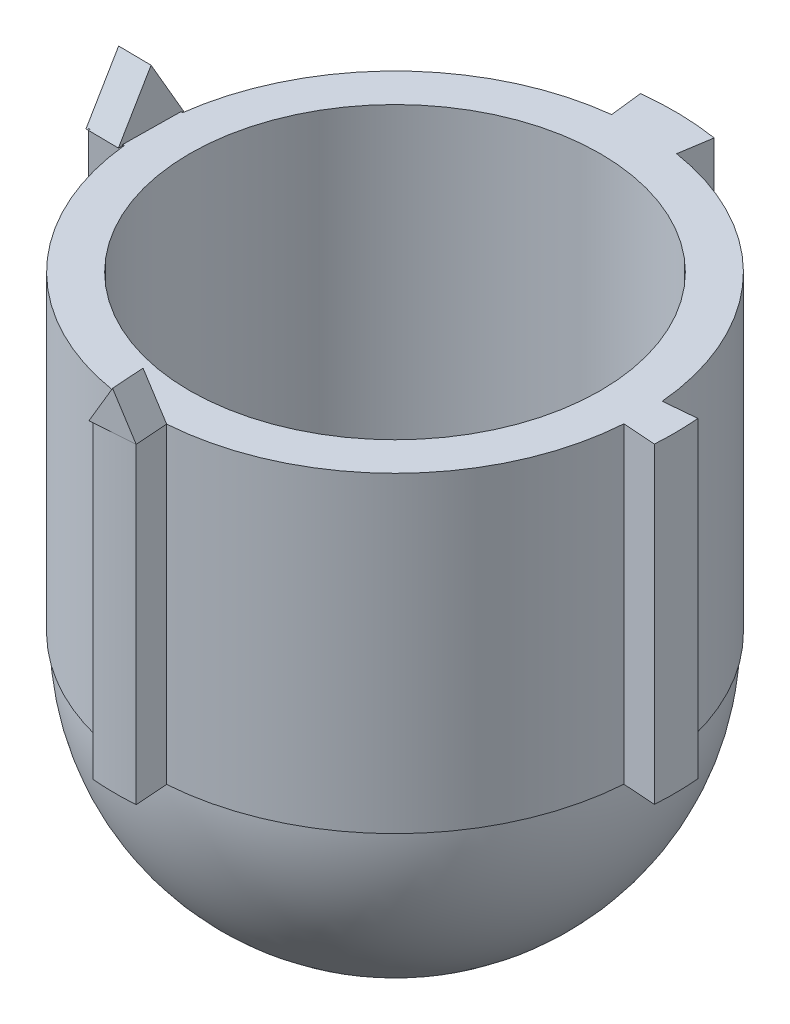
ISO-10303-21;
HEADER;
FILE_DESCRIPTION(('STEP AP214'),'2;1');
FILE_NAME('part.step','',(''),(''),'','','');
FILE_SCHEMA(('AUTOMOTIVE_DESIGN { 1 0 10303 214 1 1 1 1 }'));
ENDSEC;
DATA;
#1=APPLICATION_CONTEXT('core data for automotive mechanical design processes');
#2=APPLICATION_PROTOCOL_DEFINITION('international standard','automotive_design',2000,#1);
#3=PRODUCT_CONTEXT('',#1,'mechanical');
#4=PRODUCT('Part','Part','',(#3));
#5=PRODUCT_RELATED_PRODUCT_CATEGORY('part','',(#4));
#6=PRODUCT_DEFINITION_FORMATION('','',#4);
#7=PRODUCT_DEFINITION_CONTEXT('part definition',#1,'design');
#8=PRODUCT_DEFINITION('design','',#6,#7);
#9=PRODUCT_DEFINITION_SHAPE('','',#8);
#10=(LENGTH_UNIT() NAMED_UNIT(*) SI_UNIT(.MILLI.,.METRE.));
#11=(NAMED_UNIT(*) PLANE_ANGLE_UNIT() SI_UNIT($,.RADIAN.));
#12=(NAMED_UNIT(*) SI_UNIT($,.STERADIAN.) SOLID_ANGLE_UNIT());
#13=UNCERTAINTY_MEASURE_WITH_UNIT(LENGTH_MEASURE(1.E-05),#10,'distance_accuracy_value','');
#14=(GEOMETRIC_REPRESENTATION_CONTEXT(3) GLOBAL_UNCERTAINTY_ASSIGNED_CONTEXT((#13)) GLOBAL_UNIT_ASSIGNED_CONTEXT((#10,
#11,#12)) REPRESENTATION_CONTEXT('',''));
#15=CARTESIAN_POINT('',(0.,0.,0.));
#16=DIRECTION('',(0.,0.,1.));
#17=DIRECTION('',(1.,0.,0.));
#18=AXIS2_PLACEMENT_3D('',#15,#16,#17);
#19=CARTESIAN_POINT('',(0.,19.,0.));
#20=DIRECTION('',(0.,1.,0.));
#21=DIRECTION('',(0.,0.,1.));
#22=AXIS2_PLACEMENT_3D('',#19,#20,#21);
#23=PLANE('',#22);
#24=DIRECTION('',(-0.99991980307442,0.,-0.012664415486466));
#25=VECTOR('',#24,1.);
#26=CARTESIAN_POINT('',(0.0238732234541416,19.,-1.88491201354909));
#27=LINE('',#26,#25);
#28=CARTESIAN_POINT('',(-16.0518718364044,19.,-2.08851825683638));
#29=VERTEX_POINT('',#28);
#30=CARTESIAN_POINT('',(-16.8699349540087,19.,-2.09887937898202));
#31=VERTEX_POINT('',#30);
#32=EDGE_CURVE('E282',#29,#31,#27,.T.);
#33=ORIENTED_EDGE('',*,*,#32,.F.);
#34=DIRECTION('',(-0.99164159391928,0.,-0.12902305688996));
#35=VECTOR('',#34,1.);
#36=CARTESIAN_POINT('',(-16.8579070966278,19.,-2.19339196712932));
#37=LINE('',#36,#35);
#38=CARTESIAN_POINT('',(-16.8579070966278,19.,-2.19339196712932));
#39=VERTEX_POINT('',#38);
#40=EDGE_CURVE('E338',#29,#39,#37,.T.);
#41=ORIENTED_EDGE('',*,*,#40,.T.);
#42=CARTESIAN_POINT('',(0.,19.,0.));
#43=DIRECTION('',(0.,1.,0.));
#44=DIRECTION('',(0.,0.,-1.));
#45=AXIS2_PLACEMENT_3D('',#42,#43,#44);
#46=CIRCLE('',#45,17.);
#47=EDGE_CURVE('E344',#39,#31,#46,.T.);
#48=ORIENTED_EDGE('',*,*,#47,.T.);
#49=EDGE_LOOP('',(#33,#41,#48));
#50=FACE_BOUND('',#49,.T.);
#51=ADVANCED_FACE('F35',(#50),#23,.T.);
#52=CARTESIAN_POINT('',(0.,19.,0.));
#53=DIRECTION('',(0.,1.,0.));
#54=DIRECTION('',(0.,0.,1.));
#55=AXIS2_PLACEMENT_3D('',#52,#53,#54);
#56=CIRCLE('',#55,12.5);
#57=CARTESIAN_POINT('',(0.,19.,12.5));
#58=VERTEX_POINT('',#57);
#59=EDGE_CURVE('E329',#58,#58,#56,.T.);
#60=ORIENTED_EDGE('',*,*,#59,.F.);
#61=EDGE_LOOP('',(#60));
#62=FACE_BOUND('',#61,.T.);
#63=CARTESIAN_POINT('',(-14.8746239087892,19.,-1.9353458533494));
#64=VERTEX_POINT('',#63);
#65=CARTESIAN_POINT('',(-14.9765231401734,19.,-1.94860402082498));
#66=VERTEX_POINT('',#65);
#67=EDGE_CURVE('E340',#64,#66,#37,.T.);
#68=ORIENTED_EDGE('',*,*,#67,.T.);
#69=DIRECTION('',(-0.0126644154864656,0.,0.99991980307442));
#70=VECTOR('',#69,1.);
#71=CARTESIAN_POINT('',(-14.9987970461163,19.,-0.189966232296984));
#72=LINE('',#71,#70);
#73=CARTESIAN_POINT('',(-15.0210709520592,19.,1.568671556231));
#74=VERTEX_POINT('',#73);
#75=EDGE_CURVE('E267',#66,#74,#72,.T.);
#76=ORIENTED_EDGE('',*,*,#75,.T.);
#77=DIRECTION('',(0.994591241362186,0.,-0.103866561537509));
#78=VECTOR('',#77,1.);
#79=CARTESIAN_POINT('',(-16.9080511031572,19.,1.76573154613765));
#80=LINE('',#79,#78);
#81=CARTESIAN_POINT('',(-14.9188686204328,19.,1.55799842306263));
#82=VERTEX_POINT('',#81);
#83=EDGE_CURVE('E347',#74,#82,#80,.T.);
#84=ORIENTED_EDGE('',*,*,#83,.T.);
#85=CARTESIAN_POINT('',(0.,19.,0.));
#86=DIRECTION('',(0.,1.,0.));
#87=DIRECTION('',(0.,0.,1.));
#88=AXIS2_PLACEMENT_3D('',#85,#86,#87);
#89=CIRCLE('',#88,15.);
#90=CARTESIAN_POINT('',(-1.2901495141034,19.,14.9444141481444));
#91=VERTEX_POINT('',#90);
#92=EDGE_CURVE('E351',#82,#91,#89,.T.);
#93=ORIENTED_EDGE('',*,*,#92,.T.);
#94=DIRECTION('',(-0.0860099676068932,0.,0.996294276542961));
#95=VECTOR('',#94,1.);
#96=CARTESIAN_POINT('',(-1.46216944931718,19.,16.9370027012303));
#97=LINE('',#96,#95);
#98=CARTESIAN_POINT('',(-1.30617713125256,19.,15.1300696445552));
#99=VERTEX_POINT('',#98);
#100=EDGE_CURVE('E354',#91,#99,#97,.T.);
#101=ORIENTED_EDGE('',*,*,#100,.T.);
#102=DIRECTION('',(0.997501741299744,0.,-0.0706418863279979));
#103=VECTOR('',#102,1.);
#104=CARTESIAN_POINT('',(1.05962829491996,19.,14.9625261194962));
#105=LINE('',#104,#103);
#106=CARTESIAN_POINT('',(1.05962829491996,19.,14.9625261194962));
#107=VERTEX_POINT('',#106);
#108=EDGE_CURVE('E292',#99,#107,#105,.T.);
#109=ORIENTED_EDGE('',*,*,#108,.T.);
#110=CARTESIAN_POINT('',(0.,19.,0.));
#111=DIRECTION('',(0.,1.,0.));
#112=DIRECTION('',(0.,0.,1.));
#113=AXIS2_PLACEMENT_3D('',#110,#111,#112);
#114=CIRCLE('',#113,15.);
#115=CARTESIAN_POINT('',(14.9646165419444,19.,1.02968526869291));
#116=VERTEX_POINT('',#115);
#117=EDGE_CURVE('E362',#107,#116,#114,.T.);
#118=ORIENTED_EDGE('',*,*,#117,.T.);
#119=DIRECTION('',(0.997641102796295,0.,0.0686456845795273));
#120=VECTOR('',#119,1.);
#121=CARTESIAN_POINT('',(16.959898747537,19.,1.16697663785196));
#122=LINE('',#121,#120);
#123=CARTESIAN_POINT('',(16.959898747537,19.,1.16697663785196));
#124=VERTEX_POINT('',#123);
#125=EDGE_CURVE('E364',#116,#124,#122,.T.);
#126=ORIENTED_EDGE('',*,*,#125,.T.);
#127=CARTESIAN_POINT('',(0.,19.,0.));
#128=DIRECTION('',(0.,1.,0.));
#129=DIRECTION('',(0.,0.,-1.));
#130=AXIS2_PLACEMENT_3D('',#127,#128,#129);
#131=CIRCLE('',#130,17.);
#132=CARTESIAN_POINT('',(16.9329824125417,19.,-1.50801413009047));
#133=VERTEX_POINT('',#132);
#134=EDGE_CURVE('E366',#124,#133,#131,.T.);
#135=ORIENTED_EDGE('',*,*,#134,.T.);
#136=DIRECTION('',(-0.996057788973043,0.,0.0887067135347335));
#137=VECTOR('',#136,1.);
#138=CARTESIAN_POINT('',(16.9329824125417,19.,-1.50801413009047));
#139=LINE('',#138,#137);
#140=CARTESIAN_POINT('',(14.9408668345956,19.,-1.330600703021));
#141=VERTEX_POINT('',#140);
#142=EDGE_CURVE('E368',#133,#141,#139,.T.);
#143=ORIENTED_EDGE('',*,*,#142,.T.);
#144=CARTESIAN_POINT('',(0.,19.,0.));
#145=DIRECTION('',(0.,1.,0.));
#146=DIRECTION('',(0.,0.,1.));
#147=AXIS2_PLACEMENT_3D('',#144,#145,#146);
#148=CIRCLE('',#147,15.);
#149=CARTESIAN_POINT('',(2.32803345196332,19.,-14.818240794593));
#150=VERTEX_POINT('',#149);
#151=EDGE_CURVE('E370',#141,#150,#148,.T.);
#152=ORIENTED_EDGE('',*,*,#151,.T.);
#153=DIRECTION('',(0.155202230130888,0.,-0.987882719639532));
#154=VECTOR('',#153,1.);
#155=CARTESIAN_POINT('',(2.63843791222509,19.,-16.7940062338721));
#156=LINE('',#155,#154);
#157=CARTESIAN_POINT('',(2.63843791222509,19.,-16.7940062338721));
#158=VERTEX_POINT('',#157);
#159=EDGE_CURVE('E372',#150,#158,#156,.T.);
#160=ORIENTED_EDGE('',*,*,#159,.T.);
#161=CARTESIAN_POINT('',(0.,19.,0.));
#162=DIRECTION('',(0.,1.,0.));
#163=DIRECTION('',(0.,0.,1.));
#164=AXIS2_PLACEMENT_3D('',#161,#162,#163);
#165=CIRCLE('',#164,17.);
#166=CARTESIAN_POINT('',(-1.94175157276121,19.,-16.8887418367882));
#167=VERTEX_POINT('',#166);
#168=EDGE_CURVE('E374',#158,#167,#165,.T.);
#169=ORIENTED_EDGE('',*,*,#168,.T.);
#170=DIRECTION('',(0.11422068075066,0.,0.993455402164011));
#171=VECTOR('',#170,1.);
#172=CARTESIAN_POINT('',(-1.94175157276122,19.,-16.8887418367882));
#173=LINE('',#172,#171);
#174=CARTESIAN_POINT('',(-1.7133102112599,19.,-14.9018310324602));
#175=VERTEX_POINT('',#174);
#176=EDGE_CURVE('E376',#167,#175,#173,.T.);
#177=ORIENTED_EDGE('',*,*,#176,.T.);
#178=CARTESIAN_POINT('',(0.,19.,0.));
#179=DIRECTION('',(0.,1.,0.));
#180=DIRECTION('',(0.,0.,1.));
#181=AXIS2_PLACEMENT_3D('',#178,#179,#180);
#182=CIRCLE('',#181,15.);
#183=EDGE_CURVE('E335',#175,#64,#182,.T.);
#184=ORIENTED_EDGE('',*,*,#183,.T.);
#185=EDGE_LOOP('',(#68,#76,#84,#93,#101,#109,#118,#126,#135,#143,#152,#160,#169,#177,#184));
#186=FACE_BOUND('',#185,.T.);
#187=ADVANCED_FACE('F496',(#62,#186),#23,.T.);
#188=CARTESIAN_POINT('',(0.,0.,0.));
#189=DIRECTION('',(0.,1.,0.));
#190=DIRECTION('',(0.,0.,1.));
#191=AXIS2_PLACEMENT_3D('',#188,#189,#190);
#192=PLANE('',#191);
#193=CARTESIAN_POINT('',(0.,0.,0.));
#194=DIRECTION('',(0.,-1.,0.));
#195=DIRECTION('',(1.,0.,0.));
#196=AXIS2_PLACEMENT_3D('',#193,#194,#195);
#197=CIRCLE('',#196,14.8746239087892);
#198=CARTESIAN_POINT('',(14.8746239087892,0.,0.));
#199=VERTEX_POINT('',#198);
#200=EDGE_CURVE('E325',#199,#199,#197,.T.);
#201=ORIENTED_EDGE('',*,*,#200,.F.);
#202=EDGE_LOOP('',(#201));
#203=FACE_BOUND('',#202,.T.);
#204=CARTESIAN_POINT('',(0.,0.,0.));
#205=DIRECTION('',(0.,1.,0.));
#206=DIRECTION('',(0.,0.,1.));
#207=AXIS2_PLACEMENT_3D('',#204,#205,#206);
#208=CIRCLE('',#207,15.);
#209=CARTESIAN_POINT('',(-1.7133102112599,0.,-14.9018310324602));
#210=VERTEX_POINT('',#209);
#211=CARTESIAN_POINT('',(-14.8746239087892,0.,-1.9353458533494));
#212=VERTEX_POINT('',#211);
#213=EDGE_CURVE('E332',#210,#212,#208,.T.);
#214=ORIENTED_EDGE('',*,*,#213,.F.);
#215=DIRECTION('',(0.11422068075066,0.,0.993455402164011));
#216=VECTOR('',#215,1.);
#217=CARTESIAN_POINT('',(-1.94175157276122,0.,-16.8887418367882));
#218=LINE('',#217,#216);
#219=CARTESIAN_POINT('',(-1.94175157276121,0.,-16.8887418367882));
#220=VERTEX_POINT('',#219);
#221=EDGE_CURVE('E339',#220,#210,#218,.T.);
#222=ORIENTED_EDGE('',*,*,#221,.F.);
#223=CARTESIAN_POINT('',(0.,0.,0.));
#224=DIRECTION('',(0.,1.,0.));
#225=DIRECTION('',(0.,0.,1.));
#226=AXIS2_PLACEMENT_3D('',#223,#224,#225);
#227=CIRCLE('',#226,17.);
#228=CARTESIAN_POINT('',(2.63843791222509,0.,-16.7940062338721));
#229=VERTEX_POINT('',#228);
#230=EDGE_CURVE('E408',#229,#220,#227,.T.);
#231=ORIENTED_EDGE('',*,*,#230,.F.);
#232=DIRECTION('',(0.155202230130888,0.,-0.987882719639532));
#233=VECTOR('',#232,1.);
#234=CARTESIAN_POINT('',(2.63843791222509,0.,-16.7940062338721));
#235=LINE('',#234,#233);
#236=CARTESIAN_POINT('',(2.32803345196332,0.,-14.818240794593));
#237=VERTEX_POINT('',#236);
#238=EDGE_CURVE('E406',#237,#229,#235,.T.);
#239=ORIENTED_EDGE('',*,*,#238,.F.);
#240=CARTESIAN_POINT('',(0.,0.,0.));
#241=DIRECTION('',(0.,1.,0.));
#242=DIRECTION('',(0.,0.,1.));
#243=AXIS2_PLACEMENT_3D('',#240,#241,#242);
#244=CIRCLE('',#243,15.);
#245=CARTESIAN_POINT('',(14.9408668345956,0.,-1.330600703021));
#246=VERTEX_POINT('',#245);
#247=EDGE_CURVE('E404',#246,#237,#244,.T.);
#248=ORIENTED_EDGE('',*,*,#247,.F.);
#249=DIRECTION('',(-0.996057788973043,0.,0.0887067135347335));
#250=VECTOR('',#249,1.);
#251=CARTESIAN_POINT('',(16.9329824125417,0.,-1.50801413009047));
#252=LINE('',#251,#250);
#253=CARTESIAN_POINT('',(16.9329824125417,0.,-1.50801413009047));
#254=VERTEX_POINT('',#253);
#255=EDGE_CURVE('E402',#254,#246,#252,.T.);
#256=ORIENTED_EDGE('',*,*,#255,.F.);
#257=CARTESIAN_POINT('',(0.,0.,0.));
#258=DIRECTION('',(0.,1.,0.));
#259=DIRECTION('',(0.,0.,-1.));
#260=AXIS2_PLACEMENT_3D('',#257,#258,#259);
#261=CIRCLE('',#260,17.);
#262=CARTESIAN_POINT('',(16.959898747537,0.,1.16697663785196));
#263=VERTEX_POINT('',#262);
#264=EDGE_CURVE('E400',#263,#254,#261,.T.);
#265=ORIENTED_EDGE('',*,*,#264,.F.);
#266=DIRECTION('',(0.997641102796295,0.,0.0686456845795273));
#267=VECTOR('',#266,1.);
#268=CARTESIAN_POINT('',(16.959898747537,0.,1.16697663785196));
#269=LINE('',#268,#267);
#270=CARTESIAN_POINT('',(14.9646165419444,0.,1.02968526869291));
#271=VERTEX_POINT('',#270);
#272=EDGE_CURVE('E398',#271,#263,#269,.T.);
#273=ORIENTED_EDGE('',*,*,#272,.F.);
#274=CARTESIAN_POINT('',(0.,0.,0.));
#275=DIRECTION('',(0.,1.,0.));
#276=DIRECTION('',(0.,0.,1.));
#277=AXIS2_PLACEMENT_3D('',#274,#275,#276);
#278=CIRCLE('',#277,15.);
#279=CARTESIAN_POINT('',(1.05962829491996,0.,14.9625261194962));
#280=VERTEX_POINT('',#279);
#281=EDGE_CURVE('E396',#280,#271,#278,.T.);
#282=ORIENTED_EDGE('',*,*,#281,.F.);
#283=DIRECTION('',(-0.0706418863279975,0.,-0.997501741299744));
#284=VECTOR('',#283,1.);
#285=CARTESIAN_POINT('',(1.20091206757596,0.,16.9575296020957));
#286=LINE('',#285,#284);
#287=CARTESIAN_POINT('',(1.20091206757596,0.,16.9575296020957));
#288=VERTEX_POINT('',#287);
#289=EDGE_CURVE('E394',#288,#280,#286,.T.);
#290=ORIENTED_EDGE('',*,*,#289,.F.);
#291=CARTESIAN_POINT('',(0.,0.,0.));
#292=DIRECTION('',(0.,1.,0.));
#293=DIRECTION('',(0.,0.,-1.));
#294=AXIS2_PLACEMENT_3D('',#291,#292,#293);
#295=CIRCLE('',#294,17.);
#296=CARTESIAN_POINT('',(-1.46216944931718,0.,16.9370027012303));
#297=VERTEX_POINT('',#296);
#298=EDGE_CURVE('E392',#297,#288,#295,.T.);
#299=ORIENTED_EDGE('',*,*,#298,.F.);
#300=DIRECTION('',(-0.0860099676068932,0.,0.996294276542961));
#301=VECTOR('',#300,1.);
#302=CARTESIAN_POINT('',(-1.46216944931718,0.,16.9370027012303));
#303=LINE('',#302,#301);
#304=CARTESIAN_POINT('',(-1.2901495141034,0.,14.9444141481444));
#305=VERTEX_POINT('',#304);
#306=EDGE_CURVE('E390',#305,#297,#303,.T.);
#307=ORIENTED_EDGE('',*,*,#306,.F.);
#308=CARTESIAN_POINT('',(0.,0.,0.));
#309=DIRECTION('',(0.,1.,0.));
#310=DIRECTION('',(0.,0.,1.));
#311=AXIS2_PLACEMENT_3D('',#308,#309,#310);
#312=CIRCLE('',#311,15.);
#313=CARTESIAN_POINT('',(-14.9188686204328,0.,1.55799842306263));
#314=VERTEX_POINT('',#313);
#315=EDGE_CURVE('E388',#314,#305,#312,.T.);
#316=ORIENTED_EDGE('',*,*,#315,.F.);
#317=DIRECTION('',(0.994591241362186,0.,-0.103866561537509));
#318=VECTOR('',#317,1.);
#319=CARTESIAN_POINT('',(-16.9080511031572,0.,1.76573154613765));
#320=LINE('',#319,#318);
#321=CARTESIAN_POINT('',(-16.9080511031572,0.,1.76573154613765));
#322=VERTEX_POINT('',#321);
#323=EDGE_CURVE('E386',#322,#314,#320,.T.);
#324=ORIENTED_EDGE('',*,*,#323,.F.);
#325=CARTESIAN_POINT('',(0.,0.,0.));
#326=DIRECTION('',(0.,1.,0.));
#327=DIRECTION('',(0.,0.,-1.));
#328=AXIS2_PLACEMENT_3D('',#325,#326,#327);
#329=CIRCLE('',#328,17.);
#330=CARTESIAN_POINT('',(-16.8579070966278,0.,-2.19339196712932));
#331=VERTEX_POINT('',#330);
#332=EDGE_CURVE('E383',#331,#322,#329,.T.);
#333=ORIENTED_EDGE('',*,*,#332,.F.);
#334=DIRECTION('',(-0.99164159391928,0.,-0.12902305688996));
#335=VECTOR('',#334,1.);
#336=CARTESIAN_POINT('',(-16.8579070966278,0.,-2.19339196712932));
#337=LINE('',#336,#335);
#338=EDGE_CURVE('E381',#212,#331,#337,.T.);
#339=ORIENTED_EDGE('',*,*,#338,.F.);
#340=EDGE_LOOP('',(#214,#222,#231,#239,#248,#256,#265,#273,#282,#290,#299,#307,#316,#324,#333,#339));
#341=FACE_BOUND('',#340,.T.);
#342=ADVANCED_FACE('F506',(#203,#341),#192,.F.);
#343=CARTESIAN_POINT('',(0.,19.,0.));
#344=DIRECTION('',(0.,-1.,0.));
#345=DIRECTION('',(0.,0.,-1.));
#346=AXIS2_PLACEMENT_3D('',#343,#344,#345);
#347=CYLINDRICAL_SURFACE('',#346,15.);
#348=ORIENTED_EDGE('',*,*,#213,.T.);
#349=DIRECTION('',(0.,-1.,0.));
#350=VECTOR('',#349,1.);
#351=CARTESIAN_POINT('',(-14.8746239087892,19.,-1.9353458533494));
#352=LINE('',#351,#350);
#353=EDGE_CURVE('E456',#64,#212,#352,.T.);
#354=ORIENTED_EDGE('',*,*,#353,.F.);
#355=ORIENTED_EDGE('',*,*,#183,.F.);
#356=DIRECTION('',(0.,-1.,0.));
#357=VECTOR('',#356,1.);
#358=CARTESIAN_POINT('',(-1.7133102112599,19.,-14.9018310324602));
#359=LINE('',#358,#357);
#360=EDGE_CURVE('E378',#175,#210,#359,.T.);
#361=ORIENTED_EDGE('',*,*,#360,.T.);
#362=EDGE_LOOP('',(#348,#354,#355,#361));
#363=FACE_BOUND('',#362,.T.);
#364=ADVANCED_FACE('F37',(#363),#347,.T.);
#365=CARTESIAN_POINT('',(-16.8579070966278,19.,-2.19339196712932));
#366=DIRECTION('',(-0.12902305688996,0.,0.99164159391928));
#367=DIRECTION('',(0.99164159391928,0.,0.12902305688996));
#368=AXIS2_PLACEMENT_3D('',#365,#366,#367);
#369=PLANE('',#368);
#370=ORIENTED_EDGE('',*,*,#40,.F.);
#371=DIRECTION('',(-0.972064647153889,-0.197722460097862,-0.126475889111065));
#372=VECTOR('',#371,1.);
#373=CARTESIAN_POINT('',(-16.8263958161495,18.8424582283407,-2.1892920163419));
#374=LINE('',#373,#372);
#375=CARTESIAN_POINT('',(-16.361393564257,18.9370418442189,-2.12879030648244));
#376=VERTEX_POINT('',#375);
#377=EDGE_CURVE('E50',#29,#376,#374,.T.);
#378=ORIENTED_EDGE('',*,*,#377,.T.);
#379=DIRECTION('',(0.99164159391928,0.,0.12902305688996));
#380=VECTOR('',#379,1.);
#381=CARTESIAN_POINT('',(-16.8579070966278,18.9370418442189,-2.19339196712932));
#382=LINE('',#381,#380);
#383=CARTESIAN_POINT('',(-14.9765231401734,18.9370418442189,-1.94860402082498));
#384=VERTEX_POINT('',#383);
#385=EDGE_CURVE('E54',#376,#384,#382,.T.);
#386=ORIENTED_EDGE('',*,*,#385,.T.);
#387=DIRECTION('',(0.,-1.,0.));
#388=VECTOR('',#387,1.);
#389=CARTESIAN_POINT('',(-14.9765231401734,19.,-1.94860402082498));
#390=LINE('',#389,#388);
#391=EDGE_CURVE('E246',#66,#384,#390,.T.);
#392=ORIENTED_EDGE('',*,*,#391,.F.);
#393=ORIENTED_EDGE('',*,*,#67,.F.);
#394=ORIENTED_EDGE('',*,*,#353,.T.);
#395=ORIENTED_EDGE('',*,*,#338,.T.);
#396=DIRECTION('',(0.,-1.,0.));
#397=VECTOR('',#396,1.);
#398=CARTESIAN_POINT('',(-16.8579070966278,19.,-2.19339196712932));
#399=LINE('',#398,#397);
#400=EDGE_CURVE('E453',#39,#331,#399,.T.);
#401=ORIENTED_EDGE('',*,*,#400,.F.);
#402=EDGE_LOOP('',(#370,#378,#386,#392,#393,#394,#395,#401));
#403=FACE_BOUND('',#402,.T.);
#404=ADVANCED_FACE('F499',(#403),#369,.F.);
#405=CARTESIAN_POINT('',(0.,19.,0.));
#406=DIRECTION('',(0.,-1.,0.));
#407=DIRECTION('',(0.,0.,-1.));
#408=AXIS2_PLACEMENT_3D('',#405,#406,#407);
#409=CYLINDRICAL_SURFACE('',#408,17.);
#410=DIRECTION('',(0.,-1.,0.));
#411=VECTOR('',#410,1.);
#412=CARTESIAN_POINT('',(-16.9080511031572,19.,1.76573154613765));
#413=LINE('',#412,#411);
#414=CARTESIAN_POINT('',(-16.9080511031572,18.9370418442189,1.76573154613765));
#415=VERTEX_POINT('',#414);
#416=EDGE_CURVE('E449',#415,#322,#413,.T.);
#417=ORIENTED_EDGE('',*,*,#416,.F.);
#418=CARTESIAN_POINT('',(0.,18.9370418442189,0.));
#419=DIRECTION('',(0.,-1.,0.));
#420=DIRECTION('',(0.,0.,-1.));
#421=AXIS2_PLACEMENT_3D('',#418,#419,#420);
#422=CIRCLE('',#421,17.);
#423=CARTESIAN_POINT('',(-16.9986366522651,18.9370418442189,-0.215295063269916));
#424=VERTEX_POINT('',#423);
#425=EDGE_CURVE('E273',#415,#424,#422,.T.);
#426=ORIENTED_EDGE('',*,*,#425,.T.);
#427=CARTESIAN_POINT('',(-16.8653797492716,18.9370418442189,-2.13517350884211));
#428=VERTEX_POINT('',#427);
#429=EDGE_CURVE('E275',#424,#428,#422,.T.);
#430=ORIENTED_EDGE('',*,*,#429,.T.);
#431=CARTESIAN_POINT('',(0.,22.2650252202486,0.));
#432=DIRECTION('',(0.0109677055353606,0.500000000000004,-0.865955951209578));
#433=DIRECTION('',(0.00633220774323305,-0.866025403784436,-0.499959901537214));
#434=AXIS2_PLACEMENT_3D('',#431,#432,#433);
#435=ELLIPSE('',#434,33.9999999999997,17.);
#436=EDGE_CURVE('E11',#428,#31,#435,.T.);
#437=ORIENTED_EDGE('',*,*,#436,.T.);
#438=ORIENTED_EDGE('',*,*,#47,.F.);
#439=ORIENTED_EDGE('',*,*,#400,.T.);
#440=ORIENTED_EDGE('',*,*,#332,.T.);
#441=EDGE_LOOP('',(#417,#426,#430,#437,#438,#439,#440));
#442=FACE_BOUND('',#441,.T.);
#443=ADVANCED_FACE('F512',(#442),#409,.T.);
#444=CARTESIAN_POINT('',(-16.9080511031572,19.,1.76573154613765));
#445=DIRECTION('',(-0.103866561537509,0.,-0.994591241362186));
#446=DIRECTION('',(-0.994591241362187,0.,0.103866561537509));
#447=AXIS2_PLACEMENT_3D('',#444,#445,#446);
#448=PLANE('',#447);
#449=DIRECTION('',(0.,1.,0.));
#450=VECTOR('',#449,1.);
#451=CARTESIAN_POINT('',(-15.0210709520592,19.,1.568671556231));
#452=LINE('',#451,#450);
#453=CARTESIAN_POINT('',(-15.0210709520592,18.9370418442189,1.568671556231));
#454=VERTEX_POINT('',#453);
#455=EDGE_CURVE('E459',#454,#74,#452,.T.);
#456=ORIENTED_EDGE('',*,*,#455,.F.);
#457=DIRECTION('',(-0.994591241362187,0.,0.103866561537509));
#458=VECTOR('',#457,1.);
#459=CARTESIAN_POINT('',(-16.9080511031572,18.9370418442189,1.76573154613765));
#460=LINE('',#459,#458);
#461=EDGE_CURVE('E462',#454,#415,#460,.T.);
#462=ORIENTED_EDGE('',*,*,#461,.T.);
#463=ORIENTED_EDGE('',*,*,#416,.T.);
#464=ORIENTED_EDGE('',*,*,#323,.T.);
#465=DIRECTION('',(0.,-1.,0.));
#466=VECTOR('',#465,1.);
#467=CARTESIAN_POINT('',(-14.9188686204328,19.,1.55799842306263));
#468=LINE('',#467,#466);
#469=EDGE_CURVE('E446',#82,#314,#468,.T.);
#470=ORIENTED_EDGE('',*,*,#469,.F.);
#471=ORIENTED_EDGE('',*,*,#83,.F.);
#472=EDGE_LOOP('',(#456,#462,#463,#464,#470,#471));
#473=FACE_BOUND('',#472,.T.);
#474=ADVANCED_FACE('F491',(#473),#448,.F.);
#475=CARTESIAN_POINT('',(0.,19.,0.));
#476=DIRECTION('',(0.,-1.,0.));
#477=DIRECTION('',(0.,0.,-1.));
#478=AXIS2_PLACEMENT_3D('',#475,#476,#477);
#479=CYLINDRICAL_SURFACE('',#478,15.);
#480=ORIENTED_EDGE('',*,*,#315,.T.);
#481=DIRECTION('',(0.,-1.,0.));
#482=VECTOR('',#481,1.);
#483=CARTESIAN_POINT('',(-1.2901495141034,19.,14.9444141481444));
#484=LINE('',#483,#482);
#485=EDGE_CURVE('E443',#91,#305,#484,.T.);
#486=ORIENTED_EDGE('',*,*,#485,.F.);
#487=ORIENTED_EDGE('',*,*,#92,.F.);
#488=ORIENTED_EDGE('',*,*,#469,.T.);
#489=EDGE_LOOP('',(#480,#486,#487,#488));
#490=FACE_BOUND('',#489,.T.);
#491=ADVANCED_FACE('F540',(#490),#479,.T.);
#492=CARTESIAN_POINT('',(-1.46216944931718,19.,16.9370027012303));
#493=DIRECTION('',(0.996294276542961,0.,0.0860099676068932));
#494=DIRECTION('',(0.0860099676068932,0.,-0.996294276542961));
#495=AXIS2_PLACEMENT_3D('',#492,#493,#494);
#496=PLANE('',#495);
#497=ORIENTED_EDGE('',*,*,#306,.T.);
#498=DIRECTION('',(0.,-1.,0.));
#499=VECTOR('',#498,1.);
#500=CARTESIAN_POINT('',(-1.46216944931718,19.,16.9370027012303));
#501=LINE('',#500,#499);
#502=CARTESIAN_POINT('',(-1.46216944931718,19.,16.9370027012303));
#503=VERTEX_POINT('',#502);
#504=EDGE_CURVE('E440',#503,#297,#501,.T.);
#505=ORIENTED_EDGE('',*,*,#504,.F.);
#506=EDGE_CURVE('E353',#99,#503,#97,.T.);
#507=ORIENTED_EDGE('',*,*,#506,.F.);
#508=ORIENTED_EDGE('',*,*,#100,.F.);
#509=ORIENTED_EDGE('',*,*,#485,.T.);
#510=EDGE_LOOP('',(#497,#505,#507,#508,#509));
#511=FACE_BOUND('',#510,.T.);
#512=ADVANCED_FACE('F594',(#511),#496,.F.);
#513=CARTESIAN_POINT('',(0.,19.,0.));
#514=DIRECTION('',(0.,-1.,0.));
#515=DIRECTION('',(0.,0.,-1.));
#516=AXIS2_PLACEMENT_3D('',#513,#514,#515);
#517=CYLINDRICAL_SURFACE('',#516,17.);
#518=ORIENTED_EDGE('',*,*,#298,.T.);
#519=DIRECTION('',(0.,-1.,0.));
#520=VECTOR('',#519,1.);
#521=CARTESIAN_POINT('',(1.20091206757596,19.,16.9575296020957));
#522=LINE('',#521,#520);
#523=CARTESIAN_POINT('',(1.20091206757596,19.,16.9575296020957));
#524=VERTEX_POINT('',#523);
#525=EDGE_CURVE('E437',#524,#288,#522,.T.);
#526=ORIENTED_EDGE('',*,*,#525,.F.);
#527=CARTESIAN_POINT('',(0.,19.,0.));
#528=DIRECTION('',(0.,1.,0.));
#529=DIRECTION('',(0.,0.,-1.));
#530=AXIS2_PLACEMENT_3D('',#527,#528,#529);
#531=CIRCLE('',#530,17.);
#532=EDGE_CURVE('E357',#503,#524,#531,.T.);
#533=ORIENTED_EDGE('',*,*,#532,.F.);
#534=ORIENTED_EDGE('',*,*,#504,.T.);
#535=EDGE_LOOP('',(#518,#526,#533,#534));
#536=FACE_BOUND('',#535,.T.);
#537=ADVANCED_FACE('F590',(#536),#517,.T.);
#538=CARTESIAN_POINT('',(1.20091206757596,19.,16.9575296020957));
#539=DIRECTION('',(-0.997501741299744,0.,0.0706418863279975));
#540=DIRECTION('',(0.0706418863279975,0.,0.997501741299744));
#541=AXIS2_PLACEMENT_3D('',#538,#539,#540);
#542=PLANE('',#541);
#543=ORIENTED_EDGE('',*,*,#289,.T.);
#544=DIRECTION('',(0.,-1.,0.));
#545=VECTOR('',#544,1.);
#546=CARTESIAN_POINT('',(1.05962829491996,19.,14.9625261194962));
#547=LINE('',#546,#545);
#548=EDGE_CURVE('E434',#107,#280,#547,.T.);
#549=ORIENTED_EDGE('',*,*,#548,.F.);
#550=DIRECTION('',(-0.0706418863279975,0.,-0.997501741299744));
#551=VECTOR('',#550,1.);
#552=CARTESIAN_POINT('',(1.20091206757596,19.,16.9575296020957));
#553=LINE('',#552,#551);
#554=EDGE_CURVE('E359',#524,#107,#553,.T.);
#555=ORIENTED_EDGE('',*,*,#554,.F.);
#556=ORIENTED_EDGE('',*,*,#525,.T.);
#557=EDGE_LOOP('',(#543,#549,#555,#556));
#558=FACE_BOUND('',#557,.T.);
#559=ADVANCED_FACE('F586',(#558),#542,.F.);
#560=CARTESIAN_POINT('',(0.,19.,0.));
#561=DIRECTION('',(0.,-1.,0.));
#562=DIRECTION('',(0.,0.,-1.));
#563=AXIS2_PLACEMENT_3D('',#560,#561,#562);
#564=CYLINDRICAL_SURFACE('',#563,15.);
#565=ORIENTED_EDGE('',*,*,#281,.T.);
#566=DIRECTION('',(0.,-1.,0.));
#567=VECTOR('',#566,1.);
#568=CARTESIAN_POINT('',(14.9646165419444,19.,1.02968526869291));
#569=LINE('',#568,#567);
#570=EDGE_CURVE('E431',#116,#271,#569,.T.);
#571=ORIENTED_EDGE('',*,*,#570,.F.);
#572=ORIENTED_EDGE('',*,*,#117,.F.);
#573=ORIENTED_EDGE('',*,*,#548,.T.);
#574=EDGE_LOOP('',(#565,#571,#572,#573));
#575=FACE_BOUND('',#574,.T.);
#576=ADVANCED_FACE('F582',(#575),#564,.T.);
#577=CARTESIAN_POINT('',(16.959898747537,19.,1.16697663785196));
#578=DIRECTION('',(0.0686456845795273,0.,-0.997641102796295));
#579=DIRECTION('',(-0.997641102796295,0.,-0.0686456845795273));
#580=AXIS2_PLACEMENT_3D('',#577,#578,#579);
#581=PLANE('',#580);
#582=ORIENTED_EDGE('',*,*,#272,.T.);
#583=DIRECTION('',(0.,-1.,0.));
#584=VECTOR('',#583,1.);
#585=CARTESIAN_POINT('',(16.959898747537,19.,1.16697663785196));
#586=LINE('',#585,#584);
#587=EDGE_CURVE('E428',#124,#263,#586,.T.);
#588=ORIENTED_EDGE('',*,*,#587,.F.);
#589=ORIENTED_EDGE('',*,*,#125,.F.);
#590=ORIENTED_EDGE('',*,*,#570,.T.);
#591=EDGE_LOOP('',(#582,#588,#589,#590));
#592=FACE_BOUND('',#591,.T.);
#593=ADVANCED_FACE('F578',(#592),#581,.F.);
#594=CARTESIAN_POINT('',(0.,19.,0.));
#595=DIRECTION('',(0.,-1.,0.));
#596=DIRECTION('',(0.,0.,-1.));
#597=AXIS2_PLACEMENT_3D('',#594,#595,#596);
#598=CYLINDRICAL_SURFACE('',#597,17.);
#599=ORIENTED_EDGE('',*,*,#264,.T.);
#600=DIRECTION('',(0.,-1.,0.));
#601=VECTOR('',#600,1.);
#602=CARTESIAN_POINT('',(16.9329824125417,19.,-1.50801413009047));
#603=LINE('',#602,#601);
#604=EDGE_CURVE('E425',#133,#254,#603,.T.);
#605=ORIENTED_EDGE('',*,*,#604,.F.);
#606=ORIENTED_EDGE('',*,*,#134,.F.);
#607=ORIENTED_EDGE('',*,*,#587,.T.);
#608=EDGE_LOOP('',(#599,#605,#606,#607));
#609=FACE_BOUND('',#608,.T.);
#610=ADVANCED_FACE('F574',(#609),#598,.T.);
#611=CARTESIAN_POINT('',(16.9329824125417,19.,-1.50801413009047));
#612=DIRECTION('',(0.0887067135347335,0.,0.996057788973043));
#613=DIRECTION('',(0.996057788973043,0.,-0.0887067135347335));
#614=AXIS2_PLACEMENT_3D('',#611,#612,#613);
#615=PLANE('',#614);
#616=ORIENTED_EDGE('',*,*,#255,.T.);
#617=DIRECTION('',(0.,-1.,0.));
#618=VECTOR('',#617,1.);
#619=CARTESIAN_POINT('',(14.9408668345956,19.,-1.330600703021));
#620=LINE('',#619,#618);
#621=EDGE_CURVE('E422',#141,#246,#620,.T.);
#622=ORIENTED_EDGE('',*,*,#621,.F.);
#623=ORIENTED_EDGE('',*,*,#142,.F.);
#624=ORIENTED_EDGE('',*,*,#604,.T.);
#625=EDGE_LOOP('',(#616,#622,#623,#624));
#626=FACE_BOUND('',#625,.T.);
#627=ADVANCED_FACE('F570',(#626),#615,.F.);
#628=CARTESIAN_POINT('',(0.,19.,0.));
#629=DIRECTION('',(0.,-1.,0.));
#630=DIRECTION('',(0.,0.,-1.));
#631=AXIS2_PLACEMENT_3D('',#628,#629,#630);
#632=CYLINDRICAL_SURFACE('',#631,15.);
#633=ORIENTED_EDGE('',*,*,#247,.T.);
#634=DIRECTION('',(0.,-1.,0.));
#635=VECTOR('',#634,1.);
#636=CARTESIAN_POINT('',(2.32803345196332,19.,-14.818240794593));
#637=LINE('',#636,#635);
#638=EDGE_CURVE('E419',#150,#237,#637,.T.);
#639=ORIENTED_EDGE('',*,*,#638,.F.);
#640=ORIENTED_EDGE('',*,*,#151,.F.);
#641=ORIENTED_EDGE('',*,*,#621,.T.);
#642=EDGE_LOOP('',(#633,#639,#640,#641));
#643=FACE_BOUND('',#642,.T.);
#644=ADVANCED_FACE('F566',(#643),#632,.T.);
#645=CARTESIAN_POINT('',(2.63843791222509,19.,-16.7940062338721));
#646=DIRECTION('',(-0.987882719639532,0.,-0.155202230130888));
#647=DIRECTION('',(-0.155202230130888,0.,0.987882719639532));
#648=AXIS2_PLACEMENT_3D('',#645,#646,#647);
#649=PLANE('',#648);
#650=ORIENTED_EDGE('',*,*,#238,.T.);
#651=DIRECTION('',(0.,-1.,0.));
#652=VECTOR('',#651,1.);
#653=CARTESIAN_POINT('',(2.63843791222509,19.,-16.7940062338721));
#654=LINE('',#653,#652);
#655=EDGE_CURVE('E416',#158,#229,#654,.T.);
#656=ORIENTED_EDGE('',*,*,#655,.F.);
#657=ORIENTED_EDGE('',*,*,#159,.F.);
#658=ORIENTED_EDGE('',*,*,#638,.T.);
#659=EDGE_LOOP('',(#650,#656,#657,#658));
#660=FACE_BOUND('',#659,.T.);
#661=ADVANCED_FACE('F562',(#660),#649,.F.);
#662=CARTESIAN_POINT('',(0.,19.,0.));
#663=DIRECTION('',(0.,-1.,0.));
#664=DIRECTION('',(0.,0.,-1.));
#665=AXIS2_PLACEMENT_3D('',#662,#663,#664);
#666=CYLINDRICAL_SURFACE('',#665,17.);
#667=ORIENTED_EDGE('',*,*,#230,.T.);
#668=DIRECTION('',(0.,-1.,0.));
#669=VECTOR('',#668,1.);
#670=CARTESIAN_POINT('',(-1.94175157276121,19.,-16.8887418367882));
#671=LINE('',#670,#669);
#672=EDGE_CURVE('E413',#167,#220,#671,.T.);
#673=ORIENTED_EDGE('',*,*,#672,.F.);
#674=ORIENTED_EDGE('',*,*,#168,.F.);
#675=ORIENTED_EDGE('',*,*,#655,.T.);
#676=EDGE_LOOP('',(#667,#673,#674,#675));
#677=FACE_BOUND('',#676,.T.);
#678=ADVANCED_FACE('F558',(#677),#666,.T.);
#679=CARTESIAN_POINT('',(-1.94175157276122,19.,-16.8887418367882));
#680=DIRECTION('',(0.99345540216401,0.,-0.11422068075066));
#681=DIRECTION('',(-0.11422068075066,0.,-0.993455402164011));
#682=AXIS2_PLACEMENT_3D('',#679,#680,#681);
#683=PLANE('',#682);
#684=ORIENTED_EDGE('',*,*,#221,.T.);
#685=ORIENTED_EDGE('',*,*,#360,.F.);
#686=ORIENTED_EDGE('',*,*,#176,.F.);
#687=ORIENTED_EDGE('',*,*,#672,.T.);
#688=EDGE_LOOP('',(#684,#685,#686,#687));
#689=FACE_BOUND('',#688,.T.);
#690=ADVANCED_FACE('F554',(#689),#683,.F.);
#691=CARTESIAN_POINT('',(0.,19.,0.));
#692=DIRECTION('',(0.,-1.,0.));
#693=DIRECTION('',(0.,0.,-1.));
#694=AXIS2_PLACEMENT_3D('',#691,#692,#693);
#695=CYLINDRICAL_SURFACE('',#694,12.5);
#696=ORIENTED_EDGE('',*,*,#59,.T.);
#697=EDGE_LOOP('',(#696));
#698=FACE_BOUND('',#697,.T.);
#699=CARTESIAN_POINT('',(0.,0.,0.));
#700=DIRECTION('',(0.,1.,0.));
#701=DIRECTION('',(0.,0.,1.));
#702=AXIS2_PLACEMENT_3D('',#699,#700,#701);
#703=CIRCLE('',#702,12.5);
#704=CARTESIAN_POINT('',(0.,0.,12.5));
#705=VERTEX_POINT('',#704);
#706=EDGE_CURVE('E328',#705,#705,#703,.T.);
#707=ORIENTED_EDGE('',*,*,#706,.F.);
#708=EDGE_LOOP('',(#707));
#709=FACE_BOUND('',#708,.T.);
#710=ADVANCED_FACE('F557',(#698,#709),#695,.F.);
#711=CARTESIAN_POINT('',(0.,0.,0.));
#712=DIRECTION('',(-1.,0.,0.));
#713=DIRECTION('',(0.,0.,-1.));
#714=AXIS2_PLACEMENT_3D('',#711,#712,#713);
#715=SPHERICAL_SURFACE('',#714,9.8746239087892);
#716=CARTESIAN_POINT('',(0.,0.,0.));
#717=DIRECTION('',(0.,-1.,0.));
#718=DIRECTION('',(1.,0.,0.));
#719=AXIS2_PLACEMENT_3D('',#716,#717,#718);
#720=CIRCLE('',#719,9.8746239087892);
#721=CARTESIAN_POINT('',(-8.51517453373865,0.,-5.));
#722=VERTEX_POINT('',#721);
#723=CARTESIAN_POINT('',(8.51517453373865,0.,-5.));
#724=VERTEX_POINT('',#723);
#725=EDGE_CURVE('E317',#722,#724,#720,.T.);
#726=ORIENTED_EDGE('',*,*,#725,.F.);
#727=CARTESIAN_POINT('',(-8.51517453373865,0.,0.));
#728=DIRECTION('',(-1.,0.,0.));
#729=DIRECTION('',(0.,0.,1.));
#730=AXIS2_PLACEMENT_3D('',#727,#728,#729);
#731=CIRCLE('',#730,5.);
#732=CARTESIAN_POINT('',(-8.51517453373865,0.,5.));
#733=VERTEX_POINT('',#732);
#734=EDGE_CURVE('E322',#722,#733,#731,.T.);
#735=ORIENTED_EDGE('',*,*,#734,.T.);
#736=CARTESIAN_POINT('',(0.,0.,0.));
#737=DIRECTION('',(0.,1.,0.));
#738=DIRECTION('',(1.,0.,0.));
#739=AXIS2_PLACEMENT_3D('',#736,#737,#738);
#740=CIRCLE('',#739,9.8746239087892);
#741=CARTESIAN_POINT('',(8.51517453373865,0.,5.));
#742=VERTEX_POINT('',#741);
#743=EDGE_CURVE('E312',#733,#742,#740,.T.);
#744=ORIENTED_EDGE('',*,*,#743,.T.);
#745=CARTESIAN_POINT('',(8.51517453373865,0.,0.));
#746=DIRECTION('',(-1.,0.,0.));
#747=DIRECTION('',(0.,0.,1.));
#748=AXIS2_PLACEMENT_3D('',#745,#746,#747);
#749=CIRCLE('',#748,5.);
#750=EDGE_CURVE('E320',#724,#742,#749,.T.);
#751=ORIENTED_EDGE('',*,*,#750,.F.);
#752=EDGE_LOOP('',(#726,#735,#744,#751));
#753=FACE_BOUND('',#752,.T.);
#754=ADVANCED_FACE('F651',(#753),#715,.F.);
#755=CARTESIAN_POINT('',(-14.8746239087892,0.,0.));
#756=DIRECTION('',(-1.,0.,0.));
#757=DIRECTION('',(0.,0.,1.));
#758=AXIS2_PLACEMENT_3D('',#755,#756,#757);
#759=CYLINDRICAL_SURFACE('',#758,5.);
#760=ORIENTED_EDGE('',*,*,#734,.F.);
#761=DIRECTION('',(1.,0.,0.));
#762=VECTOR('',#761,1.);
#763=CARTESIAN_POINT('',(0.,0.,-5.));
#764=LINE('',#763,#762);
#765=EDGE_CURVE('E315',#722,#724,#764,.T.);
#766=ORIENTED_EDGE('',*,*,#765,.T.);
#767=ORIENTED_EDGE('',*,*,#750,.T.);
#768=DIRECTION('',(1.,0.,0.));
#769=VECTOR('',#768,1.);
#770=CARTESIAN_POINT('',(0.,0.,5.));
#771=LINE('',#770,#769);
#772=EDGE_CURVE('E308',#733,#742,#771,.T.);
#773=ORIENTED_EDGE('',*,*,#772,.F.);
#774=EDGE_LOOP('',(#760,#766,#767,#773));
#775=FACE_BOUND('',#774,.T.);
#776=ADVANCED_FACE('F647',(#775),#759,.T.);
#777=CARTESIAN_POINT('',(0.,0.,0.));
#778=DIRECTION('',(0.,1.,0.));
#779=DIRECTION('',(0.,0.,1.));
#780=AXIS2_PLACEMENT_3D('',#777,#778,#779);
#781=PLANE('',#780);
#782=ORIENTED_EDGE('',*,*,#765,.F.);
#783=ORIENTED_EDGE('',*,*,#725,.T.);
#784=EDGE_LOOP('',(#782,#783));
#785=FACE_BOUND('',#784,.T.);
#786=ORIENTED_EDGE('',*,*,#743,.F.);
#787=ORIENTED_EDGE('',*,*,#772,.T.);
#788=EDGE_LOOP('',(#786,#787));
#789=FACE_BOUND('',#788,.T.);
#790=ORIENTED_EDGE('',*,*,#706,.T.);
#791=EDGE_LOOP('',(#790));
#792=FACE_BOUND('',#791,.T.);
#793=ADVANCED_FACE('F650',(#785,#789,#792),#781,.T.);
#794=CARTESIAN_POINT('',(0.,0.,0.));
#795=DIRECTION('',(-1.,0.,0.));
#796=DIRECTION('',(0.,0.,1.));
#797=AXIS2_PLACEMENT_3D('',#794,#795,#796);
#798=SPHERICAL_SURFACE('',#797,14.8746239087892);
#799=CARTESIAN_POINT('',(0.,0.,0.));
#800=DIRECTION('',(0.,-1.,0.));
#801=DIRECTION('',(1.,0.,0.));
#802=AXIS2_PLACEMENT_3D('',#799,#800,#801);
#803=SPHERICAL_SURFACE('',#802,14.8746239087892);
#804=ORIENTED_EDGE('',*,*,#200,.T.);
#805=EDGE_LOOP('',(#804));
#806=FACE_BOUND('',#805,.T.);
#807=ADVANCED_FACE('F642',(#806),#803,.T.);
#808=CARTESIAN_POINT('',(1.05962829491996,19.,14.9625261194962));
#809=DIRECTION('',(0.,-1.,0.));
#810=DIRECTION('',(0.,0.,-1.));
#811=AXIS2_PLACEMENT_3D('',#808,#809,#810);
#812=PLANE('',#811);
#813=CARTESIAN_POINT('',(-1.62423813210059,19.,15.1525943461542));
#814=VERTEX_POINT('',#813);
#815=EDGE_CURVE('E287',#814,#99,#105,.T.);
#816=ORIENTED_EDGE('',*,*,#815,.T.);
#817=ORIENTED_EDGE('',*,*,#506,.T.);
#818=ORIENTED_EDGE('',*,*,#532,.T.);
#819=DIRECTION('',(0.997501741299744,0.,-0.0706418863279979));
#820=VECTOR('',#819,1.);
#821=CARTESIAN_POINT('',(1.20091206757596,19.,16.9575296020957));
#822=LINE('',#821,#820);
#823=CARTESIAN_POINT('',(-1.4829543594446,19.,17.1475978287537));
#824=VERTEX_POINT('',#823);
#825=EDGE_CURVE('E286',#824,#524,#822,.T.);
#826=ORIENTED_EDGE('',*,*,#825,.F.);
#827=DIRECTION('',(0.0706418863279974,0.,0.997501741299744));
#828=VECTOR('',#827,1.);
#829=CARTESIAN_POINT('',(-1.62423813210059,19.,15.1525943461542));
#830=LINE('',#829,#828);
#831=EDGE_CURVE('E306',#814,#824,#830,.T.);
#832=ORIENTED_EDGE('',*,*,#831,.F.);
#833=EDGE_LOOP('',(#816,#817,#818,#826,#832));
#834=FACE_BOUND('',#833,.T.);
#835=ADVANCED_FACE('F628',(#834),#812,.T.);
#836=CARTESIAN_POINT('',(-1.62423813210059,19.,15.1525943461542));
#837=DIRECTION('',(-0.86386184828479,0.500000000000004,0.0611776681312982));
#838=DIRECTION('',(-0.500938311461235,-0.86548299123112,0.));
#839=AXIS2_PLACEMENT_3D('',#836,#837,#838);
#840=PLANE('',#839);
#841=DIRECTION('',(-0.498750870649876,-0.866025403784436,0.035320943163999));
#842=VECTOR('',#841,1.);
#843=CARTESIAN_POINT('',(-1.4829543594446,19.,17.1475978287537));
#844=LINE('',#843,#842);
#845=CARTESIAN_POINT('',(-0.141021145934312,21.3301177430883,17.0525637154247));
#846=VERTEX_POINT('',#845);
#847=EDGE_CURVE('E291',#846,#824,#844,.T.);
#848=ORIENTED_EDGE('',*,*,#847,.F.);
#849=DIRECTION('',(0.0706418863279974,0.,0.997501741299744));
#850=VECTOR('',#849,1.);
#851=CARTESIAN_POINT('',(-0.282304918590307,21.3301177430883,15.0575602328252));
#852=LINE('',#851,#850);
#853=CARTESIAN_POINT('',(-0.282304918590307,21.3301177430883,15.0575602328252));
#854=VERTEX_POINT('',#853);
#855=EDGE_CURVE('E298',#854,#846,#852,.T.);
#856=ORIENTED_EDGE('',*,*,#855,.F.);
#857=DIRECTION('',(-0.498750870649876,-0.866025403784436,0.035320943163999));
#858=VECTOR('',#857,1.);
#859=CARTESIAN_POINT('',(-1.62423813210059,19.,15.1525943461542));
#860=LINE('',#859,#858);
#861=EDGE_CURVE('E295',#854,#814,#860,.T.);
#862=ORIENTED_EDGE('',*,*,#861,.T.);
#863=ORIENTED_EDGE('',*,*,#831,.T.);
#864=EDGE_LOOP('',(#848,#856,#862,#863));
#865=FACE_BOUND('',#864,.T.);
#866=ADVANCED_FACE('F634',(#865),#840,.T.);
#867=CARTESIAN_POINT('',(1.05962829491996,19.,14.9625261194962));
#868=DIRECTION('',(0.863861848284793,0.499999999999999,-0.0611776681312984));
#869=DIRECTION('',(-0.500938311461229,0.865482991231123,0.));
#870=AXIS2_PLACEMENT_3D('',#867,#868,#869);
#871=PLANE('',#870);
#872=DIRECTION('',(-0.498750870649871,0.866025403784439,0.0353209431639991));
#873=VECTOR('',#872,1.);
#874=CARTESIAN_POINT('',(1.20091206757596,19.,16.9575296020957));
#875=LINE('',#874,#873);
#876=EDGE_CURVE('E301',#524,#846,#875,.T.);
#877=ORIENTED_EDGE('',*,*,#876,.F.);
#878=ORIENTED_EDGE('',*,*,#554,.T.);
#879=DIRECTION('',(-0.498750870649871,0.866025403784439,0.0353209431639991));
#880=VECTOR('',#879,1.);
#881=CARTESIAN_POINT('',(1.05962829491996,19.,14.9625261194962));
#882=LINE('',#881,#880);
#883=EDGE_CURVE('E290',#107,#854,#882,.T.);
#884=ORIENTED_EDGE('',*,*,#883,.T.);
#885=ORIENTED_EDGE('',*,*,#855,.T.);
#886=EDGE_LOOP('',(#877,#878,#884,#885));
#887=FACE_BOUND('',#886,.T.);
#888=ADVANCED_FACE('F621',(#887),#871,.T.);
#889=CARTESIAN_POINT('',(1.05962829491997,0.,14.9625261194962));
#890=DIRECTION('',(-0.0706418863279979,0.,-0.997501741299745));
#891=DIRECTION('',(-0.997501741299745,0.,0.0706418863279979));
#892=AXIS2_PLACEMENT_3D('',#889,#890,#891);
#893=PLANE('',#892);
#894=ORIENTED_EDGE('',*,*,#815,.F.);
#895=ORIENTED_EDGE('',*,*,#861,.F.);
#896=ORIENTED_EDGE('',*,*,#883,.F.);
#897=ORIENTED_EDGE('',*,*,#108,.F.);
#898=EDGE_LOOP('',(#894,#895,#896,#897));
#899=FACE_BOUND('',#898,.T.);
#900=ADVANCED_FACE('F626',(#899),#893,.T.);
#901=CARTESIAN_POINT('',(1.20091206757596,0.,16.9575296020957));
#902=DIRECTION('',(-0.0706418863279979,0.,-0.997501741299745));
#903=DIRECTION('',(-0.997501741299745,0.,0.0706418863279979));
#904=AXIS2_PLACEMENT_3D('',#901,#902,#903);
#905=PLANE('',#904);
#906=ORIENTED_EDGE('',*,*,#825,.T.);
#907=ORIENTED_EDGE('',*,*,#876,.T.);
#908=ORIENTED_EDGE('',*,*,#847,.T.);
#909=EDGE_LOOP('',(#906,#907,#908));
#910=FACE_BOUND('',#909,.T.);
#911=ADVANCED_FACE('F632',(#910),#905,.F.);
#912=CARTESIAN_POINT('',(-14.9744634849864,18.9370418442189,-2.11122423896327));
#913=DIRECTION('',(0.,-1.,0.));
#914=DIRECTION('',(0.,0.,-1.));
#915=AXIS2_PLACEMENT_3D('',#912,#913,#914);
#916=PLANE('',#915);
#917=ORIENTED_EDGE('',*,*,#385,.F.);
#918=DIRECTION('',(-0.99991980307442,0.,-0.012664415486466));
#919=VECTOR('',#918,1.);
#920=CARTESIAN_POINT('',(-14.9744634849864,18.9370418442189,-2.11122423896327));
#921=LINE('',#920,#919);
#922=CARTESIAN_POINT('',(-14.9744634849864,18.9370418442189,-2.11122423896327));
#923=VERTEX_POINT('',#922);
#924=EDGE_CURVE('E230',#923,#376,#921,.T.);
#925=ORIENTED_EDGE('',*,*,#924,.F.);
#926=DIRECTION('',(-0.0126644154864656,0.,0.99991980307442));
#927=VECTOR('',#926,1.);
#928=CARTESIAN_POINT('',(-14.9744634849864,18.9370418442189,-2.11122423896327));
#929=LINE('',#928,#927);
#930=EDGE_CURVE('E233',#923,#384,#929,.T.);
#931=ORIENTED_EDGE('',*,*,#930,.T.);
#932=EDGE_LOOP('',(#917,#925,#931));
#933=FACE_BOUND('',#932,.T.);
#934=ADVANCED_FACE('F232',(#933),#916,.T.);
#935=ORIENTED_EDGE('',*,*,#429,.F.);
#936=DIRECTION('',(-0.0126644154864656,0.,0.99991980307442));
#937=VECTOR('',#936,1.);
#938=CARTESIAN_POINT('',(-16.9743030911352,18.9370418442189,-2.13655306993621));
#939=LINE('',#938,#937);
#940=CARTESIAN_POINT('',(-16.9743030911352,18.9370418442189,-2.13655306993621));
#941=VERTEX_POINT('',#940);
#942=EDGE_CURVE('E256',#941,#424,#939,.T.);
#943=ORIENTED_EDGE('',*,*,#942,.F.);
#944=EDGE_CURVE('E237',#428,#941,#921,.T.);
#945=ORIENTED_EDGE('',*,*,#944,.F.);
#946=EDGE_LOOP('',(#935,#943,#945));
#947=FACE_BOUND('',#946,.T.);
#948=ADVANCED_FACE('F746',(#947),#916,.T.);
#949=ORIENTED_EDGE('',*,*,#425,.F.);
#950=ORIENTED_EDGE('',*,*,#461,.F.);
#951=CARTESIAN_POINT('',(-15.0241904531663,18.9370418442189,1.81497198249518));
#952=VERTEX_POINT('',#951);
#953=EDGE_CURVE('E248',#454,#952,#929,.T.);
#954=ORIENTED_EDGE('',*,*,#953,.T.);
#955=DIRECTION('',(-0.99991980307442,0.,-0.012664415486466));
#956=VECTOR('',#955,1.);
#957=CARTESIAN_POINT('',(-15.0241904531663,18.9370418442189,1.81497198249518));
#958=LINE('',#957,#956);
#959=CARTESIAN_POINT('',(-17.0240300593151,18.9370418442189,1.78964315152225));
#960=VERTEX_POINT('',#959);
#961=EDGE_CURVE('E236',#952,#960,#958,.T.);
#962=ORIENTED_EDGE('',*,*,#961,.T.);
#963=EDGE_CURVE('E263',#424,#960,#939,.T.);
#964=ORIENTED_EDGE('',*,*,#963,.F.);
#965=EDGE_LOOP('',(#949,#950,#954,#962,#964));
#966=FACE_BOUND('',#965,.T.);
#967=ADVANCED_FACE('F487',(#966),#916,.T.);
#968=CARTESIAN_POINT('',(-14.9987970461163,0.,-0.189966232296984));
#969=DIRECTION('',(-0.99991980307442,0.,-0.0126644154864656));
#970=DIRECTION('',(-0.0126644154864656,0.,0.99991980307442));
#971=AXIS2_PLACEMENT_3D('',#968,#969,#970);
#972=PLANE('',#971);
#973=ORIENTED_EDGE('',*,*,#75,.F.);
#974=ORIENTED_EDGE('',*,*,#391,.T.);
#975=ORIENTED_EDGE('',*,*,#930,.F.);
#976=DIRECTION('',(0.00633220774323243,-0.866025403784436,-0.499959901537214));
#977=VECTOR('',#976,1.);
#978=CARTESIAN_POINT('',(-14.9993269690763,22.3375002185516,-0.148126128234049));
#979=LINE('',#978,#977);
#980=CARTESIAN_POINT('',(-14.9993269690763,22.3375002185516,-0.148126128234049));
#981=VERTEX_POINT('',#980);
#982=EDGE_CURVE('E244',#981,#923,#979,.T.);
#983=ORIENTED_EDGE('',*,*,#982,.F.);
#984=DIRECTION('',(0.00633220774323331,0.866025403784436,-0.499959901537215));
#985=VECTOR('',#984,1.);
#986=CARTESIAN_POINT('',(-15.0241904531663,18.9370418442189,1.81497198249518));
#987=LINE('',#986,#985);
#988=EDGE_CURVE('E247',#952,#981,#987,.T.);
#989=ORIENTED_EDGE('',*,*,#988,.F.);
#990=ORIENTED_EDGE('',*,*,#953,.F.);
#991=ORIENTED_EDGE('',*,*,#455,.T.);
#992=EDGE_LOOP('',(#973,#974,#975,#983,#989,#990,#991));
#993=FACE_BOUND('',#992,.T.);
#994=ADVANCED_FACE('F242',(#993),#972,.F.);
#995=CARTESIAN_POINT('',(-14.9993269690763,22.3375002185516,-0.148126128234049));
#996=DIRECTION('',(0.0109677055353606,0.500000000000004,-0.865955951209578));
#997=DIRECTION('',(0.,0.866008039074077,0.500030075354545));
#998=AXIS2_PLACEMENT_3D('',#995,#996,#997);
#999=PLANE('',#998);
#1000=ORIENTED_EDGE('',*,*,#377,.F.);
#1001=ORIENTED_EDGE('',*,*,#32,.T.);
#1002=ORIENTED_EDGE('',*,*,#436,.F.);
#1003=ORIENTED_EDGE('',*,*,#944,.T.);
#1004=DIRECTION('',(0.00633220774323243,-0.866025403784436,-0.499959901537214));
#1005=VECTOR('',#1004,1.);
#1006=CARTESIAN_POINT('',(-16.9991665752252,22.3375002185516,-0.173454959206981));
#1007=LINE('',#1006,#1005);
#1008=CARTESIAN_POINT('',(-16.9991665752252,22.3375002185516,-0.173454959206981));
#1009=VERTEX_POINT('',#1008);
#1010=EDGE_CURVE('E260',#1009,#941,#1007,.T.);
#1011=ORIENTED_EDGE('',*,*,#1010,.F.);
#1012=DIRECTION('',(-0.99991980307442,0.,-0.012664415486466));
#1013=VECTOR('',#1012,1.);
#1014=CARTESIAN_POINT('',(-14.9993269690763,22.3375002185516,-0.148126128234049));
#1015=LINE('',#1014,#1013);
#1016=EDGE_CURVE('E252',#981,#1009,#1015,.T.);
#1017=ORIENTED_EDGE('',*,*,#1016,.F.);
#1018=ORIENTED_EDGE('',*,*,#982,.T.);
#1019=ORIENTED_EDGE('',*,*,#924,.T.);
#1020=EDGE_LOOP('',(#1000,#1001,#1002,#1003,#1011,#1017,#1018,#1019));
#1021=FACE_BOUND('',#1020,.T.);
#1022=ADVANCED_FACE('F250',(#1021),#999,.T.);
#1023=CARTESIAN_POINT('',(-15.0241904531663,18.9370418442189,1.81497198249518));
#1024=DIRECTION('',(-0.0109677055353606,0.500000000000005,0.865955951209578));
#1025=DIRECTION('',(0.,-0.866008039074077,0.500030075354546));
#1026=AXIS2_PLACEMENT_3D('',#1023,#1024,#1025);
#1027=PLANE('',#1026);
#1028=CARTESIAN_POINT('',(0.,22.4099752168546,0.));
#1029=DIRECTION('',(-0.0109677055353606,0.500000000000005,0.865955951209578));
#1030=DIRECTION('',(-0.00633220774323306,-0.866025403784436,0.499959901537215));
#1031=AXIS2_PLACEMENT_3D('',#1028,#1029,#1030);
#1032=ELLIPSE('',#1031,33.9999999999997,17.);
#1033=CARTESIAN_POINT('',(-16.9091947559418,19.,1.75474576666583));
#1034=VERTEX_POINT('',#1033);
#1035=CARTESIAN_POINT('',(-16.9080511031572,18.9809986842694,1.76573154613765));
#1036=VERTEX_POINT('',#1035);
#1037=EDGE_CURVE('E277',#1034,#1036,#1032,.T.);
#1038=ORIENTED_EDGE('',*,*,#1037,.F.);
#1039=DIRECTION('',(0.99991980307442,0.,0.012664415486466));
#1040=VECTOR('',#1039,1.);
#1041=CARTESIAN_POINT('',(-0.0249330693742262,19.,1.96859222167498));
#1042=LINE('',#1041,#1040);
#1043=CARTESIAN_POINT('',(-16.8143569018852,19.,1.75594692898297));
#1044=VERTEX_POINT('',#1043);
#1045=EDGE_CURVE('E280',#1034,#1044,#1042,.T.);
#1046=ORIENTED_EDGE('',*,*,#1045,.T.);
#1047=DIRECTION('',(0.974956062780663,0.197722460097862,-0.101816032234994));
#1048=VECTOR('',#1047,1.);
#1049=CARTESIAN_POINT('',(-16.9043882060097,18.9817415249601,1.76534902463921));
#1050=LINE('',#1049,#1048);
#1051=EDGE_CURVE('E43',#1036,#1044,#1050,.T.);
#1052=ORIENTED_EDGE('',*,*,#1051,.F.);
#1053=EDGE_LOOP('',(#1038,#1046,#1052));
#1054=FACE_BOUND('',#1053,.T.);
#1055=DIRECTION('',(0.00633220774323331,0.866025403784436,-0.499959901537215));
#1056=VECTOR('',#1055,1.);
#1057=CARTESIAN_POINT('',(-17.0240300593151,18.9370418442189,1.78964315152225));
#1058=LINE('',#1057,#1056);
#1059=EDGE_CURVE('E253',#960,#1009,#1058,.T.);
#1060=ORIENTED_EDGE('',*,*,#1059,.F.);
#1061=ORIENTED_EDGE('',*,*,#961,.F.);
#1062=ORIENTED_EDGE('',*,*,#988,.T.);
#1063=ORIENTED_EDGE('',*,*,#1016,.T.);
#1064=EDGE_LOOP('',(#1060,#1061,#1062,#1063));
#1065=FACE_BOUND('',#1064,.T.);
#1066=ADVANCED_FACE('F475',(#1054,#1065),#1027,.T.);
#1067=CARTESIAN_POINT('',(-16.9986366522651,0.,-0.215295063269916));
#1068=DIRECTION('',(-0.99991980307442,0.,-0.0126644154864656));
#1069=DIRECTION('',(-0.0126644154864656,0.,0.99991980307442));
#1070=AXIS2_PLACEMENT_3D('',#1067,#1068,#1069);
#1071=PLANE('',#1070);
#1072=ORIENTED_EDGE('',*,*,#942,.T.);
#1073=ORIENTED_EDGE('',*,*,#963,.T.);
#1074=ORIENTED_EDGE('',*,*,#1059,.T.);
#1075=ORIENTED_EDGE('',*,*,#1010,.T.);
#1076=EDGE_LOOP('',(#1072,#1073,#1074,#1075));
#1077=FACE_BOUND('',#1076,.T.);
#1078=ADVANCED_FACE('F478',(#1077),#1071,.T.);
#1079=CARTESIAN_POINT('',(-16.9080511031572,19.,1.76573154613765));
#1080=VERTEX_POINT('',#1079);
#1081=EDGE_CURVE('E450',#1080,#1036,#413,.T.);
#1082=ORIENTED_EDGE('',*,*,#1081,.T.);
#1083=ORIENTED_EDGE('',*,*,#1051,.T.);
#1084=EDGE_CURVE('E348',#1080,#1044,#80,.T.);
#1085=ORIENTED_EDGE('',*,*,#1084,.F.);
#1086=EDGE_LOOP('',(#1082,#1083,#1085));
#1087=FACE_BOUND('',#1086,.T.);
#1088=ADVANCED_FACE('F466',(#1087),#448,.F.);
#1089=EDGE_CURVE('E343',#1034,#1080,#46,.T.);
#1090=ORIENTED_EDGE('',*,*,#1089,.F.);
#1091=ORIENTED_EDGE('',*,*,#1037,.T.);
#1092=ORIENTED_EDGE('',*,*,#1081,.F.);
#1093=EDGE_LOOP('',(#1090,#1091,#1092));
#1094=FACE_BOUND('',#1093,.T.);
#1095=ADVANCED_FACE('F474',(#1094),#409,.T.);
#1096=ORIENTED_EDGE('',*,*,#1045,.F.);
#1097=ORIENTED_EDGE('',*,*,#1089,.T.);
#1098=ORIENTED_EDGE('',*,*,#1084,.T.);
#1099=EDGE_LOOP('',(#1096,#1097,#1098));
#1100=FACE_BOUND('',#1099,.T.);
#1101=ADVANCED_FACE('F471',(#1100),#23,.T.);
#1102=CLOSED_SHELL('',(#51,#187,#342,#364,#404,#443,#474,#491,#512,#537,#559,#576,#593,#610,
#627,#644,#661,#678,#690,#710,#754,#776,#793,#807,#835,#866,#888,#900,#911,#934,#948,#967,#994,
#1022,#1066,#1078,#1088,#1095,#1101));
#1103=MANIFOLD_SOLID_BREP('B2',#1102);
#1104=ADVANCED_BREP_SHAPE_REPRESENTATION('',(#18,#1103),#14);
#1105=SHAPE_DEFINITION_REPRESENTATION(#9,#1104);
ENDSEC;
END-ISO-10303-21;
